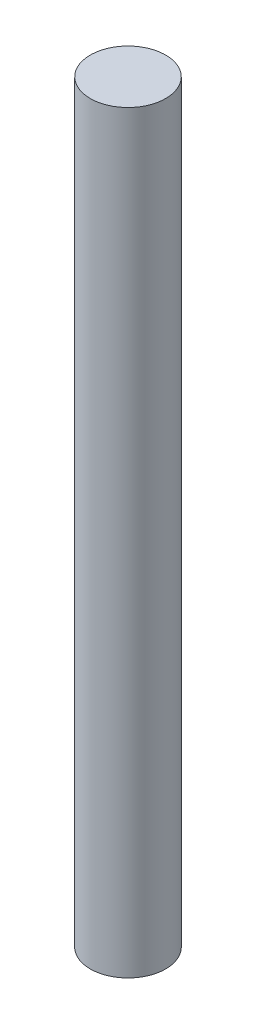
ISO-10303-21;
HEADER;
FILE_DESCRIPTION(('STEP AP214'),'2;1');
FILE_NAME('part.step','',(''),(''),'','','');
FILE_SCHEMA(('AUTOMOTIVE_DESIGN { 1 0 10303 214 1 1 1 1 }'));
ENDSEC;
DATA;
#1=APPLICATION_CONTEXT('core data for automotive mechanical design processes');
#2=APPLICATION_PROTOCOL_DEFINITION('international standard','automotive_design',2000,#1);
#3=PRODUCT_CONTEXT('',#1,'mechanical');
#4=PRODUCT('Part','Part','',(#3));
#5=PRODUCT_RELATED_PRODUCT_CATEGORY('part','',(#4));
#6=PRODUCT_DEFINITION_FORMATION('','',#4);
#7=PRODUCT_DEFINITION_CONTEXT('part definition',#1,'design');
#8=PRODUCT_DEFINITION('design','',#6,#7);
#9=PRODUCT_DEFINITION_SHAPE('','',#8);
#10=(LENGTH_UNIT() NAMED_UNIT(*) SI_UNIT(.MILLI.,.METRE.));
#11=(NAMED_UNIT(*) PLANE_ANGLE_UNIT() SI_UNIT($,.RADIAN.));
#12=(NAMED_UNIT(*) SI_UNIT($,.STERADIAN.) SOLID_ANGLE_UNIT());
#13=UNCERTAINTY_MEASURE_WITH_UNIT(LENGTH_MEASURE(1.E-05),#10,'distance_accuracy_value','');
#14=(GEOMETRIC_REPRESENTATION_CONTEXT(3) GLOBAL_UNCERTAINTY_ASSIGNED_CONTEXT((#13)) GLOBAL_UNIT_ASSIGNED_CONTEXT((#10,
#11,#12)) REPRESENTATION_CONTEXT('',''));
#15=CARTESIAN_POINT('',(0.,0.,0.));
#16=DIRECTION('',(0.,0.,1.));
#17=DIRECTION('',(1.,0.,0.));
#18=AXIS2_PLACEMENT_3D('',#15,#16,#17);
#19=CARTESIAN_POINT('',(0.,10.16,0.));
#20=DIRECTION('',(0.,-1.,0.));
#21=DIRECTION('',(0.,0.,-1.));
#22=AXIS2_PLACEMENT_3D('',#19,#20,#21);
#23=CYLINDRICAL_SURFACE('',#22,0.508);
#24=CARTESIAN_POINT('',(0.,10.16,0.));
#25=DIRECTION('',(0.,1.,0.));
#26=DIRECTION('',(0.,0.,1.));
#27=AXIS2_PLACEMENT_3D('',#24,#25,#26);
#28=CIRCLE('',#27,0.508);
#29=CARTESIAN_POINT('',(0.,10.16,0.508));
#30=VERTEX_POINT('',#29);
#31=EDGE_CURVE('E10',#30,#30,#28,.T.);
#32=ORIENTED_EDGE('',*,*,#31,.F.);
#33=EDGE_LOOP('',(#32));
#34=FACE_BOUND('',#33,.T.);
#35=CARTESIAN_POINT('',(0.,0.,0.));
#36=DIRECTION('',(0.,1.,0.));
#37=DIRECTION('',(0.,0.,1.));
#38=AXIS2_PLACEMENT_3D('',#35,#36,#37);
#39=CIRCLE('',#38,0.508);
#40=CARTESIAN_POINT('',(0.,0.,0.508));
#41=VERTEX_POINT('',#40);
#42=EDGE_CURVE('E40',#41,#41,#39,.T.);
#43=ORIENTED_EDGE('',*,*,#42,.T.);
#44=EDGE_LOOP('',(#43));
#45=FACE_BOUND('',#44,.T.);
#46=ADVANCED_FACE('F37',(#34,#45),#23,.T.);
#47=CARTESIAN_POINT('',(0.,10.16,0.));
#48=DIRECTION('',(0.,1.,0.));
#49=DIRECTION('',(0.,0.,1.));
#50=AXIS2_PLACEMENT_3D('',#47,#48,#49);
#51=PLANE('',#50);
#52=ORIENTED_EDGE('',*,*,#31,.T.);
#53=EDGE_LOOP('',(#52));
#54=FACE_BOUND('',#53,.T.);
#55=ADVANCED_FACE('F52',(#54),#51,.T.);
#56=CARTESIAN_POINT('',(0.,0.,0.));
#57=DIRECTION('',(0.,1.,0.));
#58=DIRECTION('',(0.,0.,1.));
#59=AXIS2_PLACEMENT_3D('',#56,#57,#58);
#60=PLANE('',#59);
#61=ORIENTED_EDGE('',*,*,#42,.F.);
#62=EDGE_LOOP('',(#61));
#63=FACE_BOUND('',#62,.T.);
#64=ADVANCED_FACE('F50',(#63),#60,.F.);
#65=CLOSED_SHELL('',(#46,#55,#64));
#66=MANIFOLD_SOLID_BREP('B2',#65);
#67=ADVANCED_BREP_SHAPE_REPRESENTATION('',(#18,#66),#14);
#68=SHAPE_DEFINITION_REPRESENTATION(#9,#67);
ENDSEC;
END-ISO-10303-21;
